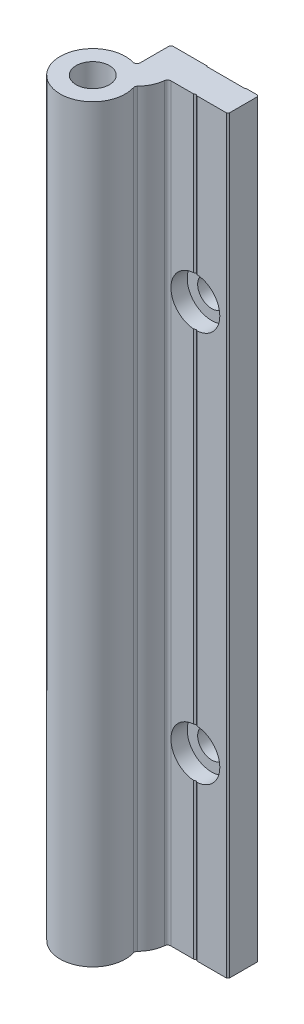
ISO-10303-21;
HEADER;
FILE_DESCRIPTION(('STEP AP214'),'2;1');
FILE_NAME('part.step','',(''),(''),'','','');
FILE_SCHEMA(('AUTOMOTIVE_DESIGN { 1 0 10303 214 1 1 1 1 }'));
ENDSEC;
DATA;
#1=APPLICATION_CONTEXT('core data for automotive mechanical design processes');
#2=APPLICATION_PROTOCOL_DEFINITION('international standard','automotive_design',2000,#1);
#3=PRODUCT_CONTEXT('',#1,'mechanical');
#4=PRODUCT('Part','Part','',(#3));
#5=PRODUCT_RELATED_PRODUCT_CATEGORY('part','',(#4));
#6=PRODUCT_DEFINITION_FORMATION('','',#4);
#7=PRODUCT_DEFINITION_CONTEXT('part definition',#1,'design');
#8=PRODUCT_DEFINITION('design','',#6,#7);
#9=PRODUCT_DEFINITION_SHAPE('','',#8);
#10=(LENGTH_UNIT() NAMED_UNIT(*) SI_UNIT(.MILLI.,.METRE.));
#11=(NAMED_UNIT(*) PLANE_ANGLE_UNIT() SI_UNIT($,.RADIAN.));
#12=(NAMED_UNIT(*) SI_UNIT($,.STERADIAN.) SOLID_ANGLE_UNIT());
#13=UNCERTAINTY_MEASURE_WITH_UNIT(LENGTH_MEASURE(1.E-05),#10,'distance_accuracy_value','');
#14=(GEOMETRIC_REPRESENTATION_CONTEXT(3) GLOBAL_UNCERTAINTY_ASSIGNED_CONTEXT((#13)) GLOBAL_UNIT_ASSIGNED_CONTEXT((#10,
#11,#12)) REPRESENTATION_CONTEXT('',''));
#15=CARTESIAN_POINT('',(0.,0.,0.));
#16=DIRECTION('',(0.,0.,1.));
#17=DIRECTION('',(1.,0.,0.));
#18=AXIS2_PLACEMENT_3D('',#15,#16,#17);
#19=CARTESIAN_POINT('',(-31.,0.,20.));
#20=DIRECTION('',(0.,1.,0.));
#21=DIRECTION('',(0.272727272012548,0.,-0.962091386044275));
#22=AXIS2_PLACEMENT_3D('',#19,#20,#21);
#23=CYLINDRICAL_SURFACE('',#22,9.999999998689);
#24=DIRECTION('',(0.,-1.,0.));
#25=VECTOR('',#24,1.);
#26=CARTESIAN_POINT('',(-28.272727280232,230.,10.379086140819));
#27=LINE('',#26,#25);
#28=CARTESIAN_POINT('',(-28.272727280232,0.,10.379086140819));
#29=VERTEX_POINT('',#28);
#30=CARTESIAN_POINT('',(-28.272727280232,230.,10.379086140819));
#31=VERTEX_POINT('',#30);
#32=EDGE_CURVE('E197',#29,#31,#27,.F.);
#33=ORIENTED_EDGE('',*,*,#32,.F.);
#34=CARTESIAN_POINT('',(-31.,0.,20.));
#35=DIRECTION('',(0.,1.,0.));
#36=DIRECTION('',(0.272727272012548,0.,-0.962091386044275));
#37=AXIS2_PLACEMENT_3D('',#34,#35,#36);
#38=CIRCLE('',#37,9.999999998689);
#39=CARTESIAN_POINT('',(-21.44507801,0.,17.04983632));
#40=VERTEX_POINT('',#39);
#41=EDGE_CURVE('E183',#40,#29,#38,.F.);
#42=ORIENTED_EDGE('',*,*,#41,.F.);
#43=DIRECTION('',(0.,1.,0.));
#44=VECTOR('',#43,1.);
#45=CARTESIAN_POINT('',(-21.44507801,0.,17.04983632));
#46=LINE('',#45,#44);
#47=CARTESIAN_POINT('',(-21.44507801,230.,17.04983632));
#48=VERTEX_POINT('',#47);
#49=EDGE_CURVE('E196',#40,#48,#46,.T.);
#50=ORIENTED_EDGE('',*,*,#49,.T.);
#51=CARTESIAN_POINT('',(-31.,230.,20.));
#52=DIRECTION('',(0.,-1.,0.));
#53=DIRECTION('',(0.95549219912528,0.,-0.295016368038685));
#54=AXIS2_PLACEMENT_3D('',#51,#52,#53);
#55=CIRCLE('',#54,9.999999998689);
#56=EDGE_CURVE('E209',#48,#31,#55,.T.);
#57=ORIENTED_EDGE('',*,*,#56,.T.);
#58=EDGE_LOOP('',(#33,#42,#50,#57));
#59=FACE_BOUND('',#58,.T.);
#60=ADVANCED_FACE('F16',(#59),#23,.T.);
#61=CARTESIAN_POINT('',(-41.529458419107,230.,-1.E-08));
#62=DIRECTION('',(0.,1.,0.));
#63=DIRECTION('',(0.,0.,1.));
#64=AXIS2_PLACEMENT_3D('',#61,#62,#63);
#65=PLANE('',#64);
#66=DIRECTION('',(-1.,0.,0.));
#67=VECTOR('',#66,1.);
#68=CARTESIAN_POINT('',(-16.00000001,230.,-1.E-08));
#69=LINE('',#68,#67);
#70=CARTESIAN_POINT('',(-26.50000001,230.,-1.E-08));
#71=VERTEX_POINT('',#70);
#72=CARTESIAN_POINT('',(-16.00000001,230.,-1.E-08));
#73=VERTEX_POINT('',#72);
#74=EDGE_CURVE('E220',#71,#73,#69,.F.);
#75=ORIENTED_EDGE('',*,*,#74,.F.);
#76=DIRECTION('',(-0.707106781186553,0.,0.707106781186542));
#77=VECTOR('',#76,1.);
#78=CARTESIAN_POINT('',(-26.50000001,230.,-1.E-08));
#79=LINE('',#78,#77);
#80=CARTESIAN_POINT('',(-27.00000001,230.,0.49999999));
#81=VERTEX_POINT('',#80);
#82=EDGE_CURVE('E225',#81,#71,#79,.F.);
#83=ORIENTED_EDGE('',*,*,#82,.F.);
#84=DIRECTION('',(2.73935E-10,0.,1.));
#85=VECTOR('',#84,1.);
#86=CARTESIAN_POINT('',(-27.00000001,230.,0.49999999));
#87=LINE('',#86,#85);
#88=CARTESIAN_POINT('',(-27.000000007557,230.,9.41699475));
#89=VERTEX_POINT('',#88);
#90=EDGE_CURVE('E229',#89,#81,#87,.F.);
#91=ORIENTED_EDGE('',*,*,#90,.F.);
#92=CARTESIAN_POINT('',(-28.00000001,230.,9.41699475));
#93=DIRECTION('',(0.,-1.,0.));
#94=DIRECTION('',(1.,0.,0.));
#95=AXIS2_PLACEMENT_3D('',#92,#93,#94);
#96=CIRCLE('',#95,1.000000002443);
#97=EDGE_CURVE('E233',#31,#89,#96,.F.);
#98=ORIENTED_EDGE('',*,*,#97,.F.);
#99=ORIENTED_EDGE('',*,*,#56,.F.);
#100=CARTESIAN_POINT('',(-20.48958581,230.,16.75481996));
#101=DIRECTION('',(0.,-1.,0.));
#102=DIRECTION('',(-0.955492201467411,0.,0.295016360453045));
#103=AXIS2_PLACEMENT_3D('',#100,#101,#102);
#104=CIRCLE('',#103,1.000000000992);
#105=CARTESIAN_POINT('',(-21.204863349397,230.,16.055979460589));
#106=VERTEX_POINT('',#105);
#107=EDGE_CURVE('E237',#106,#48,#104,.F.);
#108=ORIENTED_EDGE('',*,*,#107,.F.);
#109=CARTESIAN_POINT('',(-28.,230.,9.41699475));
#110=DIRECTION('',(0.,1.,0.));
#111=DIRECTION('',(0.715277541820788,0.,0.698840495511538));
#112=AXIS2_PLACEMENT_3D('',#109,#110,#111);
#113=CIRCLE('',#112,9.500000001863);
#114=CARTESIAN_POINT('',(-18.550668239928,230.,10.396856640007));
#115=VERTEX_POINT('',#114);
#116=EDGE_CURVE('E241',#115,#106,#113,.F.);
#117=ORIENTED_EDGE('',*,*,#116,.F.);
#118=CARTESIAN_POINT('',(-17.55600174,230.,10.5));
#119=DIRECTION('',(0.,-1.,0.));
#120=DIRECTION('',(-0.994666500529985,0.,-0.103143360054993));
#121=AXIS2_PLACEMENT_3D('',#118,#119,#120);
#122=CIRCLE('',#121,0.999999999734);
#123=CARTESIAN_POINT('',(-17.55600174,230.,9.500000000266));
#124=VERTEX_POINT('',#123);
#125=EDGE_CURVE('E245',#124,#115,#122,.F.);
#126=ORIENTED_EDGE('',*,*,#125,.F.);
#127=DIRECTION('',(1.,0.,0.));
#128=VECTOR('',#127,1.);
#129=CARTESIAN_POINT('',(-17.55600174,230.,9.5));
#130=LINE('',#129,#128);
#131=CARTESIAN_POINT('',(-10.5,230.,9.5));
#132=VERTEX_POINT('',#131);
#133=EDGE_CURVE('E249',#132,#124,#130,.F.);
#134=ORIENTED_EDGE('',*,*,#133,.F.);
#135=DIRECTION('',(0.866025407230551,0.,-0.499999994031158));
#136=VECTOR('',#135,1.);
#137=CARTESIAN_POINT('',(-10.5,230.,9.5));
#138=LINE('',#137,#136);
#139=CARTESIAN_POINT('',(-10.,230.,9.21132487));
#140=VERTEX_POINT('',#139);
#141=EDGE_CURVE('E253',#140,#132,#138,.F.);
#142=ORIENTED_EDGE('',*,*,#141,.F.);
#143=DIRECTION('',(0.866025407230547,0.,0.499999994031166));
#144=VECTOR('',#143,1.);
#145=CARTESIAN_POINT('',(-10.,230.,9.21132487));
#146=LINE('',#145,#144);
#147=CARTESIAN_POINT('',(-9.5,230.,9.5));
#148=VERTEX_POINT('',#147);
#149=EDGE_CURVE('E257',#148,#140,#146,.F.);
#150=ORIENTED_EDGE('',*,*,#149,.F.);
#151=DIRECTION('',(1.,0.,0.));
#152=VECTOR('',#151,1.);
#153=CARTESIAN_POINT('',(-9.5,230.,9.5));
#154=LINE('',#153,#152);
#155=CARTESIAN_POINT('',(-0.5,230.,9.5));
#156=VERTEX_POINT('',#155);
#157=EDGE_CURVE('E261',#156,#148,#154,.F.);
#158=ORIENTED_EDGE('',*,*,#157,.F.);
#159=DIRECTION('',(0.70710678118655,0.,-0.707106781186545));
#160=VECTOR('',#159,1.);
#161=CARTESIAN_POINT('',(-0.5,230.,9.5));
#162=LINE('',#161,#160);
#163=CARTESIAN_POINT('',(0.,230.,9.));
#164=VERTEX_POINT('',#163);
#165=EDGE_CURVE('E265',#164,#156,#162,.F.);
#166=ORIENTED_EDGE('',*,*,#165,.F.);
#167=DIRECTION('',(-7.35295E-10,0.,-1.));
#168=VECTOR('',#167,1.);
#169=CARTESIAN_POINT('',(0.,230.,9.));
#170=LINE('',#169,#168);
#171=CARTESIAN_POINT('',(-6.25E-09,230.,0.49999999125));
#172=VERTEX_POINT('',#171);
#173=EDGE_CURVE('E269',#172,#164,#170,.F.);
#174=ORIENTED_EDGE('',*,*,#173,.F.);
#175=DIRECTION('',(-0.707106782954312,0.,-0.707106779418783));
#176=VECTOR('',#175,1.);
#177=CARTESIAN_POINT('',(-6.25E-09,230.,0.49999999125));
#178=LINE('',#177,#176);
#179=CARTESIAN_POINT('',(-0.50000001,230.,-1.E-08));
#180=VERTEX_POINT('',#179);
#181=EDGE_CURVE('E273',#180,#172,#178,.F.);
#182=ORIENTED_EDGE('',*,*,#181,.F.);
#183=DIRECTION('',(-1.,0.,0.));
#184=VECTOR('',#183,1.);
#185=CARTESIAN_POINT('',(-0.50000001,230.,-1.E-08));
#186=LINE('',#185,#184);
#187=CARTESIAN_POINT('',(-4.00000001,230.,-1.E-08));
#188=VERTEX_POINT('',#187);
#189=EDGE_CURVE('E277',#188,#180,#186,.F.);
#190=ORIENTED_EDGE('',*,*,#189,.F.);
#191=DIRECTION('',(-0.707106781186553,0.,0.707106781186542));
#192=VECTOR('',#191,1.);
#193=CARTESIAN_POINT('',(-4.00000001,230.,-1.E-08));
#194=LINE('',#193,#192);
#195=CARTESIAN_POINT('',(-4.20000001,230.,0.19999999));
#196=VERTEX_POINT('',#195);
#197=EDGE_CURVE('E281',#196,#188,#194,.F.);
#198=ORIENTED_EDGE('',*,*,#197,.F.);
#199=DIRECTION('',(-1.,0.,0.));
#200=VECTOR('',#199,1.);
#201=CARTESIAN_POINT('',(-4.20000001,230.,0.19999999));
#202=LINE('',#201,#200);
#203=CARTESIAN_POINT('',(-15.80000001,230.,0.19999999));
#204=VERTEX_POINT('',#203);
#205=EDGE_CURVE('E285',#204,#196,#202,.F.);
#206=ORIENTED_EDGE('',*,*,#205,.F.);
#207=DIRECTION('',(-0.707106781186553,0.,-0.707106781186543));
#208=VECTOR('',#207,1.);
#209=CARTESIAN_POINT('',(-15.80000001,230.,0.19999999));
#210=LINE('',#209,#208);
#211=EDGE_CURVE('E289',#73,#204,#210,.F.);
#212=ORIENTED_EDGE('',*,*,#211,.F.);
#213=EDGE_LOOP('',(#75,#83,#91,#98,#99,#108,#117,#126,#134,#142,#150,#158,#166,#174,#182,#190,
#198,#206,#212));
#214=FACE_BOUND('',#213,.T.);
#215=CARTESIAN_POINT('',(-31.,230.,20.));
#216=DIRECTION('',(0.,-1.,0.));
#217=DIRECTION('',(1.,0.,0.));
#218=AXIS2_PLACEMENT_3D('',#215,#216,#217);
#219=CIRCLE('',#218,5.1);
#220=CARTESIAN_POINT('',(-25.9,230.,20.));
#221=VERTEX_POINT('',#220);
#222=EDGE_CURVE('E293',#221,#221,#219,.T.);
#223=ORIENTED_EDGE('',*,*,#222,.T.);
#224=EDGE_LOOP('',(#223));
#225=FACE_BOUND('',#224,.T.);
#226=ADVANCED_FACE('F724',(#214,#225),#65,.T.);
#227=CARTESIAN_POINT('',(-28.00000001,0.,9.41699475));
#228=DIRECTION('',(0.,1.,0.));
#229=DIRECTION('',(-0.27272726911178,0.,0.962091386866565));
#230=AXIS2_PLACEMENT_3D('',#227,#228,#229);
#231=CYLINDRICAL_SURFACE('',#230,1.000000003257);
#232=ORIENTED_EDGE('',*,*,#97,.T.);
#233=DIRECTION('',(0.,-1.,0.));
#234=VECTOR('',#233,1.);
#235=CARTESIAN_POINT('',(-27.000000006743,230.,9.41699475));
#236=LINE('',#235,#234);
#237=CARTESIAN_POINT('',(-27.000000006743,0.,9.41699475));
#238=VERTEX_POINT('',#237);
#239=EDGE_CURVE('E204',#238,#89,#236,.F.);
#240=ORIENTED_EDGE('',*,*,#239,.F.);
#241=CARTESIAN_POINT('',(-28.00000001,0.,9.41699475));
#242=DIRECTION('',(0.,-1.,0.));
#243=DIRECTION('',(1.,0.,0.));
#244=AXIS2_PLACEMENT_3D('',#241,#242,#243);
#245=CIRCLE('',#244,1.000000003257);
#246=EDGE_CURVE('E189',#238,#29,#245,.T.);
#247=ORIENTED_EDGE('',*,*,#246,.T.);
#248=ORIENTED_EDGE('',*,*,#32,.T.);
#249=EDGE_LOOP('',(#232,#240,#247,#248));
#250=FACE_BOUND('',#249,.T.);
#251=ADVANCED_FACE('F202',(#250),#231,.F.);
#252=CARTESIAN_POINT('',(-41.1423842036,0.,-1.E-08));
#253=DIRECTION('',(0.,-1.,0.));
#254=DIRECTION('',(1.,0.,0.));
#255=AXIS2_PLACEMENT_3D('',#252,#253,#254);
#256=PLANE('',#255);
#257=DIRECTION('',(0.707106781186548,0.,-0.707106781186547));
#258=VECTOR('',#257,1.);
#259=CARTESIAN_POINT('',(-27.00000001,0.,0.49999999));
#260=LINE('',#259,#258);
#261=CARTESIAN_POINT('',(-27.00000001,0.,0.49999999));
#262=VERTEX_POINT('',#261);
#263=CARTESIAN_POINT('',(-26.50000001,0.,-1.E-08));
#264=VERTEX_POINT('',#263);
#265=EDGE_CURVE('E205',#262,#264,#260,.T.);
#266=ORIENTED_EDGE('',*,*,#265,.T.);
#267=DIRECTION('',(1.,0.,0.));
#268=VECTOR('',#267,1.);
#269=CARTESIAN_POINT('',(-26.50000001,0.,-1.E-08));
#270=LINE('',#269,#268);
#271=CARTESIAN_POINT('',(-16.00000001,0.,-1.E-08));
#272=VERTEX_POINT('',#271);
#273=EDGE_CURVE('E304',#264,#272,#270,.T.);
#274=ORIENTED_EDGE('',*,*,#273,.T.);
#275=DIRECTION('',(0.707106781186553,0.,0.707106781186543));
#276=VECTOR('',#275,1.);
#277=CARTESIAN_POINT('',(-16.00000001,0.,-1.E-08));
#278=LINE('',#277,#276);
#279=CARTESIAN_POINT('',(-15.80000001,0.,0.19999999));
#280=VERTEX_POINT('',#279);
#281=EDGE_CURVE('E309',#272,#280,#278,.T.);
#282=ORIENTED_EDGE('',*,*,#281,.T.);
#283=DIRECTION('',(1.,0.,0.));
#284=VECTOR('',#283,1.);
#285=CARTESIAN_POINT('',(-15.80000001,0.,0.19999999));
#286=LINE('',#285,#284);
#287=CARTESIAN_POINT('',(-4.20000001,0.,0.19999999));
#288=VERTEX_POINT('',#287);
#289=EDGE_CURVE('E314',#280,#288,#286,.T.);
#290=ORIENTED_EDGE('',*,*,#289,.T.);
#291=DIRECTION('',(0.707106781186528,0.,-0.707106781186567));
#292=VECTOR('',#291,1.);
#293=CARTESIAN_POINT('',(-4.20000001,0.,0.19999999));
#294=LINE('',#293,#292);
#295=CARTESIAN_POINT('',(-4.00000001,0.,-1.E-08));
#296=VERTEX_POINT('',#295);
#297=EDGE_CURVE('E319',#288,#296,#294,.T.);
#298=ORIENTED_EDGE('',*,*,#297,.T.);
#299=DIRECTION('',(1.,0.,0.));
#300=VECTOR('',#299,1.);
#301=CARTESIAN_POINT('',(-4.00000001,0.,-1.E-08));
#302=LINE('',#301,#300);
#303=CARTESIAN_POINT('',(-0.50000001,0.,-1.E-08));
#304=VERTEX_POINT('',#303);
#305=EDGE_CURVE('E324',#296,#304,#302,.T.);
#306=ORIENTED_EDGE('',*,*,#305,.T.);
#307=DIRECTION('',(0.707106784722084,0.,0.707106777651011));
#308=VECTOR('',#307,1.);
#309=CARTESIAN_POINT('',(-0.50000001,0.,-1.E-08));
#310=LINE('',#309,#308);
#311=CARTESIAN_POINT('',(-3.835E-09,0.,0.499999991165));
#312=VERTEX_POINT('',#311);
#313=EDGE_CURVE('E329',#304,#312,#310,.T.);
#314=ORIENTED_EDGE('',*,*,#313,.T.);
#315=DIRECTION('',(4.5117E-10,0.,1.));
#316=VECTOR('',#315,1.);
#317=CARTESIAN_POINT('',(-3.835E-09,0.,0.499999991165));
#318=LINE('',#317,#316);
#319=CARTESIAN_POINT('',(0.,0.,9.));
#320=VERTEX_POINT('',#319);
#321=EDGE_CURVE('E334',#312,#320,#318,.T.);
#322=ORIENTED_EDGE('',*,*,#321,.T.);
#323=DIRECTION('',(-0.707106781186545,0.,0.70710678118655));
#324=VECTOR('',#323,1.);
#325=CARTESIAN_POINT('',(0.,0.,9.));
#326=LINE('',#325,#324);
#327=CARTESIAN_POINT('',(-0.5,0.,9.5));
#328=VERTEX_POINT('',#327);
#329=EDGE_CURVE('E339',#320,#328,#326,.T.);
#330=ORIENTED_EDGE('',*,*,#329,.T.);
#331=DIRECTION('',(-1.,0.,0.));
#332=VECTOR('',#331,1.);
#333=CARTESIAN_POINT('',(-0.5,0.,9.5));
#334=LINE('',#333,#332);
#335=CARTESIAN_POINT('',(-9.5,0.,9.5));
#336=VERTEX_POINT('',#335);
#337=EDGE_CURVE('E344',#328,#336,#334,.T.);
#338=ORIENTED_EDGE('',*,*,#337,.T.);
#339=DIRECTION('',(-0.866025407230548,0.,-0.499999994031164));
#340=VECTOR('',#339,1.);
#341=CARTESIAN_POINT('',(-9.5,0.,9.5));
#342=LINE('',#341,#340);
#343=CARTESIAN_POINT('',(-10.,0.,9.21132487));
#344=VERTEX_POINT('',#343);
#345=EDGE_CURVE('E349',#336,#344,#342,.T.);
#346=ORIENTED_EDGE('',*,*,#345,.T.);
#347=DIRECTION('',(-0.866025407230543,0.,0.499999994031172));
#348=VECTOR('',#347,1.);
#349=CARTESIAN_POINT('',(-10.,0.,9.21132487));
#350=LINE('',#349,#348);
#351=CARTESIAN_POINT('',(-10.5,0.,9.5));
#352=VERTEX_POINT('',#351);
#353=EDGE_CURVE('E354',#344,#352,#350,.T.);
#354=ORIENTED_EDGE('',*,*,#353,.T.);
#355=DIRECTION('',(-1.,0.,0.));
#356=VECTOR('',#355,1.);
#357=CARTESIAN_POINT('',(-10.5,0.,9.5));
#358=LINE('',#357,#356);
#359=CARTESIAN_POINT('',(-17.55600174,0.,9.5));
#360=VERTEX_POINT('',#359);
#361=EDGE_CURVE('E359',#352,#360,#358,.T.);
#362=ORIENTED_EDGE('',*,*,#361,.T.);
#363=CARTESIAN_POINT('',(-17.55600174,0.,10.5));
#364=DIRECTION('',(0.,1.,0.));
#365=DIRECTION('',(0.,0.,-1.));
#366=AXIS2_PLACEMENT_3D('',#363,#364,#365);
#367=CIRCLE('',#366,1.);
#368=CARTESIAN_POINT('',(-18.55066824053,0.,10.396856639945));
#369=VERTEX_POINT('',#368);
#370=EDGE_CURVE('E364',#369,#360,#367,.F.);
#371=ORIENTED_EDGE('',*,*,#370,.F.);
#372=CARTESIAN_POINT('',(-28.,0.,9.41699475));
#373=DIRECTION('',(0.,-1.,0.));
#374=DIRECTION('',(0.994666500865166,0.,0.103143356822661));
#375=AXIS2_PLACEMENT_3D('',#372,#373,#374);
#376=CIRCLE('',#375,9.500000001524);
#377=CARTESIAN_POINT('',(-21.204863351612,0.,16.055979458425));
#378=VERTEX_POINT('',#377);
#379=EDGE_CURVE('E369',#369,#378,#376,.T.);
#380=ORIENTED_EDGE('',*,*,#379,.T.);
#381=CARTESIAN_POINT('',(-20.48958581,0.,16.75481996));
#382=DIRECTION('',(0.,1.,0.));
#383=DIRECTION('',(-0.715277538687942,0.,-0.69884049871807));
#384=AXIS2_PLACEMENT_3D('',#381,#382,#383);
#385=CIRCLE('',#384,1.000000002828);
#386=EDGE_CURVE('E192',#40,#378,#385,.F.);
#387=ORIENTED_EDGE('',*,*,#386,.F.);
#388=ORIENTED_EDGE('',*,*,#41,.T.);
#389=ORIENTED_EDGE('',*,*,#246,.F.);
#390=DIRECTION('',(-1.82623E-10,0.,-1.));
#391=VECTOR('',#390,1.);
#392=CARTESIAN_POINT('',(-27.000000008372,0.,9.41699475));
#393=LINE('',#392,#391);
#394=EDGE_CURVE('E376',#238,#262,#393,.T.);
#395=ORIENTED_EDGE('',*,*,#394,.T.);
#396=EDGE_LOOP('',(#266,#274,#282,#290,#298,#306,#314,#322,#330,#338,#346,#354,#362,#371,#380,
#387,#388,#389,#395));
#397=FACE_BOUND('',#396,.T.);
#398=CARTESIAN_POINT('',(-31.,0.,20.));
#399=DIRECTION('',(0.,1.,0.));
#400=DIRECTION('',(-1.,0.,0.));
#401=AXIS2_PLACEMENT_3D('',#398,#399,#400);
#402=CIRCLE('',#401,5.1);
#403=CARTESIAN_POINT('',(-36.1,0.,20.));
#404=VERTEX_POINT('',#403);
#405=EDGE_CURVE('E380',#404,#404,#402,.T.);
#406=ORIENTED_EDGE('',*,*,#405,.T.);
#407=EDGE_LOOP('',(#406));
#408=FACE_BOUND('',#407,.T.);
#409=ADVANCED_FACE('F186',(#397,#408),#256,.T.);
#410=CARTESIAN_POINT('',(-20.48958581,0.,16.75481996));
#411=DIRECTION('',(0.,1.,0.));
#412=DIRECTION('',(-0.715277538687942,0.,-0.698840498718069));
#413=AXIS2_PLACEMENT_3D('',#410,#411,#412);
#414=CYLINDRICAL_SURFACE('',#413,1.000000001834);
#415=ORIENTED_EDGE('',*,*,#107,.T.);
#416=ORIENTED_EDGE('',*,*,#49,.F.);
#417=ORIENTED_EDGE('',*,*,#386,.T.);
#418=DIRECTION('',(0.,1.,0.));
#419=VECTOR('',#418,1.);
#420=CARTESIAN_POINT('',(-21.20486335,0.,16.05597946));
#421=LINE('',#420,#419);
#422=EDGE_CURVE('E385',#378,#106,#421,.T.);
#423=ORIENTED_EDGE('',*,*,#422,.T.);
#424=EDGE_LOOP('',(#415,#416,#417,#423));
#425=FACE_BOUND('',#424,.T.);
#426=ADVANCED_FACE('F736',(#425),#414,.F.);
#427=CARTESIAN_POINT('',(-16.00000001,0.,-1.E-08));
#428=DIRECTION('',(0.,0.,-1.));
#429=DIRECTION('',(-1.,0.,0.));
#430=AXIS2_PLACEMENT_3D('',#427,#428,#429);
#431=PLANE('',#430);
#432=ORIENTED_EDGE('',*,*,#74,.T.);
#433=DIRECTION('',(0.,-1.,0.));
#434=VECTOR('',#433,1.);
#435=CARTESIAN_POINT('',(-16.00000001,230.,-1.E-08));
#436=LINE('',#435,#434);
#437=EDGE_CURVE('E388',#272,#73,#436,.F.);
#438=ORIENTED_EDGE('',*,*,#437,.F.);
#439=ORIENTED_EDGE('',*,*,#273,.F.);
#440=DIRECTION('',(0.,1.,0.));
#441=VECTOR('',#440,1.);
#442=CARTESIAN_POINT('',(-26.50000001,0.,-1.E-08));
#443=LINE('',#442,#441);
#444=EDGE_CURVE('E392',#264,#71,#443,.T.);
#445=ORIENTED_EDGE('',*,*,#444,.T.);
#446=EDGE_LOOP('',(#432,#438,#439,#445));
#447=FACE_BOUND('',#446,.T.);
#448=ADVANCED_FACE('F739',(#447),#431,.T.);
#449=CARTESIAN_POINT('',(-26.50000001,0.,-1.E-08));
#450=DIRECTION('',(-0.707106781186548,0.,-0.707106781186548));
#451=DIRECTION('',(-0.707106781186548,0.,0.707106781186548));
#452=AXIS2_PLACEMENT_3D('',#449,#450,#451);
#453=PLANE('',#452);
#454=ORIENTED_EDGE('',*,*,#82,.T.);
#455=ORIENTED_EDGE('',*,*,#444,.F.);
#456=ORIENTED_EDGE('',*,*,#265,.F.);
#457=DIRECTION('',(0.,1.,0.));
#458=VECTOR('',#457,1.);
#459=CARTESIAN_POINT('',(-27.00000001,0.,0.49999999));
#460=LINE('',#459,#458);
#461=EDGE_CURVE('E397',#262,#81,#460,.T.);
#462=ORIENTED_EDGE('',*,*,#461,.T.);
#463=EDGE_LOOP('',(#454,#455,#456,#462));
#464=FACE_BOUND('',#463,.T.);
#465=ADVANCED_FACE('F743',(#464),#453,.T.);
#466=CARTESIAN_POINT('',(-27.00000001,0.,0.49999999));
#467=DIRECTION('',(-1.,0.,0.));
#468=DIRECTION('',(0.,0.,1.));
#469=AXIS2_PLACEMENT_3D('',#466,#467,#468);
#470=PLANE('',#469);
#471=ORIENTED_EDGE('',*,*,#90,.T.);
#472=ORIENTED_EDGE('',*,*,#461,.F.);
#473=ORIENTED_EDGE('',*,*,#394,.F.);
#474=ORIENTED_EDGE('',*,*,#239,.T.);
#475=EDGE_LOOP('',(#471,#472,#473,#474));
#476=FACE_BOUND('',#475,.T.);
#477=ADVANCED_FACE('F747',(#476),#470,.T.);
#478=CARTESIAN_POINT('',(-28.,0.,9.41699475));
#479=DIRECTION('',(0.,1.,0.));
#480=DIRECTION('',(0.715277541820787,0.,0.698840495511538));
#481=AXIS2_PLACEMENT_3D('',#478,#479,#480);
#482=CYLINDRICAL_SURFACE('',#481,9.50000000179);
#483=ORIENTED_EDGE('',*,*,#116,.T.);
#484=ORIENTED_EDGE('',*,*,#422,.F.);
#485=ORIENTED_EDGE('',*,*,#379,.F.);
#486=DIRECTION('',(0.,1.,0.));
#487=VECTOR('',#486,1.);
#488=CARTESIAN_POINT('',(-18.55066824,0.,10.39685664));
#489=LINE('',#488,#487);
#490=EDGE_CURVE('E402',#369,#115,#489,.T.);
#491=ORIENTED_EDGE('',*,*,#490,.T.);
#492=EDGE_LOOP('',(#483,#484,#485,#491));
#493=FACE_BOUND('',#492,.T.);
#494=ADVANCED_FACE('F751',(#493),#482,.T.);
#495=CARTESIAN_POINT('',(-17.55600174,0.,10.5));
#496=DIRECTION('',(0.,1.,0.));
#497=DIRECTION('',(0.,0.,-1.));
#498=AXIS2_PLACEMENT_3D('',#495,#496,#497);
#499=CYLINDRICAL_SURFACE('',#498,1.);
#500=ORIENTED_EDGE('',*,*,#125,.T.);
#501=ORIENTED_EDGE('',*,*,#490,.F.);
#502=ORIENTED_EDGE('',*,*,#370,.T.);
#503=DIRECTION('',(0.,1.,0.));
#504=VECTOR('',#503,1.);
#505=CARTESIAN_POINT('',(-17.55600174,0.,9.5));
#506=LINE('',#505,#504);
#507=EDGE_CURVE('E407',#360,#124,#506,.T.);
#508=ORIENTED_EDGE('',*,*,#507,.T.);
#509=EDGE_LOOP('',(#500,#501,#502,#508));
#510=FACE_BOUND('',#509,.T.);
#511=ADVANCED_FACE('F754',(#510),#499,.F.);
#512=CARTESIAN_POINT('',(-17.55600174,0.,9.5));
#513=DIRECTION('',(0.,0.,1.));
#514=DIRECTION('',(1.,0.,0.));
#515=AXIS2_PLACEMENT_3D('',#512,#513,#514);
#516=PLANE('',#515);
#517=CARTESIAN_POINT('',(-10.,175.,9.5));
#518=DIRECTION('',(0.,0.,-1.));
#519=DIRECTION('',(-1.,0.,0.));
#520=AXIS2_PLACEMENT_3D('',#517,#518,#519);
#521=CIRCLE('',#520,7.5);
#522=CARTESIAN_POINT('',(-10.5,167.516685226452,9.5));
#523=VERTEX_POINT('',#522);
#524=CARTESIAN_POINT('',(-10.5,182.483314773548,9.5));
#525=VERTEX_POINT('',#524);
#526=EDGE_CURVE('E412',#523,#525,#521,.T.);
#527=ORIENTED_EDGE('',*,*,#526,.T.);
#528=DIRECTION('',(0.,1.,0.));
#529=VECTOR('',#528,1.);
#530=CARTESIAN_POINT('',(-10.5,182.483314773548,9.5));
#531=LINE('',#530,#529);
#532=EDGE_CURVE('E417',#525,#132,#531,.T.);
#533=ORIENTED_EDGE('',*,*,#532,.T.);
#534=ORIENTED_EDGE('',*,*,#133,.T.);
#535=ORIENTED_EDGE('',*,*,#507,.F.);
#536=ORIENTED_EDGE('',*,*,#361,.F.);
#537=DIRECTION('',(0.,1.,0.));
#538=VECTOR('',#537,1.);
#539=CARTESIAN_POINT('',(-10.5,0.,9.5));
#540=LINE('',#539,#538);
#541=CARTESIAN_POINT('',(-10.5,47.516685226452,9.5));
#542=VERTEX_POINT('',#541);
#543=EDGE_CURVE('E422',#352,#542,#540,.T.);
#544=ORIENTED_EDGE('',*,*,#543,.T.);
#545=CARTESIAN_POINT('',(-10.,55.,9.5));
#546=DIRECTION('',(0.,0.,-1.));
#547=DIRECTION('',(-1.,0.,0.));
#548=AXIS2_PLACEMENT_3D('',#545,#546,#547);
#549=CIRCLE('',#548,7.5);
#550=CARTESIAN_POINT('',(-10.5,62.483314773548,9.5));
#551=VERTEX_POINT('',#550);
#552=EDGE_CURVE('E427',#542,#551,#549,.T.);
#553=ORIENTED_EDGE('',*,*,#552,.T.);
#554=DIRECTION('',(0.,1.,0.));
#555=VECTOR('',#554,1.);
#556=CARTESIAN_POINT('',(-10.5,62.483314773548,9.5));
#557=LINE('',#556,#555);
#558=EDGE_CURVE('E432',#551,#523,#557,.T.);
#559=ORIENTED_EDGE('',*,*,#558,.T.);
#560=EDGE_LOOP('',(#527,#533,#534,#535,#536,#544,#553,#559));
#561=FACE_BOUND('',#560,.T.);
#562=ADVANCED_FACE('F463',(#561),#516,.T.);
#563=CARTESIAN_POINT('',(-10.5,182.483314773548,9.5));
#564=DIRECTION('',(0.499999994031163,0.,0.866025407230549));
#565=DIRECTION('',(0.866025407230549,0.,-0.499999994031163));
#566=AXIS2_PLACEMENT_3D('',#563,#564,#565);
#567=PLANE('',#566);
#568=CARTESIAN_POINT('',(-10.5,182.483314773548,9.5));
#569=CARTESIAN_POINT('',(-10.3335652531924,182.49443516283,9.4039088556576));
#570=CARTESIAN_POINT('',(-10.1668058392343,182.5,9.30763026465145));
#571=CARTESIAN_POINT('',(-10.0000000000002,182.5,9.21132487000011));
#572=B_SPLINE_CURVE_WITH_KNOTS('',3,(#568,#569,#570,#571),.UNSPECIFIED.,.F.,.F.,(4,4),(0.,1.),.UNSPECIFIED.);
#573=CARTESIAN_POINT('',(-10.,182.5,9.21132487));
#574=VERTEX_POINT('',#573);
#575=EDGE_CURVE('E437',#525,#574,#572,.T.);
#576=ORIENTED_EDGE('',*,*,#575,.T.);
#577=DIRECTION('',(0.,1.,0.));
#578=VECTOR('',#577,1.);
#579=CARTESIAN_POINT('',(-10.,182.5,9.21132487));
#580=LINE('',#579,#578);
#581=EDGE_CURVE('E450',#574,#140,#580,.T.);
#582=ORIENTED_EDGE('',*,*,#581,.T.);
#583=ORIENTED_EDGE('',*,*,#141,.T.);
#584=ORIENTED_EDGE('',*,*,#532,.F.);
#585=EDGE_LOOP('',(#576,#582,#583,#584));
#586=FACE_BOUND('',#585,.T.);
#587=ADVANCED_FACE('F452',(#586),#567,.T.);
#588=CARTESIAN_POINT('',(-10.,182.483314773548,9.21132487));
#589=DIRECTION('',(-0.499999994031163,0.,0.866025407230549));
#590=DIRECTION('',(0.866025407230549,0.,0.499999994031163));
#591=AXIS2_PLACEMENT_3D('',#588,#589,#590);
#592=PLANE('',#591);
#593=CARTESIAN_POINT('',(-10.,182.5,9.21132487));
#594=CARTESIAN_POINT('',(-9.83319416076501,182.5,9.30763026465184));
#595=CARTESIAN_POINT('',(-9.66643474680778,182.49443516283,9.40390885565749));
#596=CARTESIAN_POINT('',(-9.50000000000019,182.483314773548,9.49999999999989));
#597=B_SPLINE_CURVE_WITH_KNOTS('',3,(#593,#594,#595,#596),.UNSPECIFIED.,.F.,.F.,(4,4),(0.,1.),.UNSPECIFIED.);
#598=CARTESIAN_POINT('',(-9.5,182.483314773548,9.5));
#599=VERTEX_POINT('',#598);
#600=EDGE_CURVE('E486',#574,#599,#597,.T.);
#601=ORIENTED_EDGE('',*,*,#600,.T.);
#602=DIRECTION('',(0.,1.,0.));
#603=VECTOR('',#602,1.);
#604=CARTESIAN_POINT('',(-9.5,182.483314773548,9.5));
#605=LINE('',#604,#603);
#606=EDGE_CURVE('E477',#599,#148,#605,.T.);
#607=ORIENTED_EDGE('',*,*,#606,.T.);
#608=ORIENTED_EDGE('',*,*,#149,.T.);
#609=ORIENTED_EDGE('',*,*,#581,.F.);
#610=EDGE_LOOP('',(#601,#607,#608,#609));
#611=FACE_BOUND('',#610,.T.);
#612=ADVANCED_FACE('F462',(#611),#592,.T.);
#613=CARTESIAN_POINT('',(-9.5,0.,9.5));
#614=DIRECTION('',(0.,0.,1.));
#615=DIRECTION('',(1.,0.,0.));
#616=AXIS2_PLACEMENT_3D('',#613,#614,#615);
#617=PLANE('',#616);
#618=CARTESIAN_POINT('',(-10.,175.,9.5));
#619=DIRECTION('',(0.,0.,-1.));
#620=DIRECTION('',(1.,0.,0.));
#621=AXIS2_PLACEMENT_3D('',#618,#619,#620);
#622=CIRCLE('',#621,7.5);
#623=CARTESIAN_POINT('',(-9.5,167.516685226452,9.5));
#624=VERTEX_POINT('',#623);
#625=EDGE_CURVE('E485',#599,#624,#622,.T.);
#626=ORIENTED_EDGE('',*,*,#625,.T.);
#627=DIRECTION('',(0.,-1.,0.));
#628=VECTOR('',#627,1.);
#629=CARTESIAN_POINT('',(-9.5,167.516685226452,9.5));
#630=LINE('',#629,#628);
#631=CARTESIAN_POINT('',(-9.5,62.483314773548,9.5));
#632=VERTEX_POINT('',#631);
#633=EDGE_CURVE('E491',#632,#624,#630,.F.);
#634=ORIENTED_EDGE('',*,*,#633,.F.);
#635=CARTESIAN_POINT('',(-10.,55.,9.5));
#636=DIRECTION('',(0.,0.,-1.));
#637=DIRECTION('',(1.,0.,0.));
#638=AXIS2_PLACEMENT_3D('',#635,#636,#637);
#639=CIRCLE('',#638,7.5);
#640=CARTESIAN_POINT('',(-9.5,47.516685226452,9.5));
#641=VERTEX_POINT('',#640);
#642=EDGE_CURVE('E495',#632,#641,#639,.T.);
#643=ORIENTED_EDGE('',*,*,#642,.T.);
#644=DIRECTION('',(0.,-1.,0.));
#645=VECTOR('',#644,1.);
#646=CARTESIAN_POINT('',(-9.5,47.516685226452,9.5));
#647=LINE('',#646,#645);
#648=EDGE_CURVE('E500',#336,#641,#647,.F.);
#649=ORIENTED_EDGE('',*,*,#648,.F.);
#650=ORIENTED_EDGE('',*,*,#337,.F.);
#651=DIRECTION('',(0.,1.,0.));
#652=VECTOR('',#651,1.);
#653=CARTESIAN_POINT('',(-0.5,0.,9.5));
#654=LINE('',#653,#652);
#655=EDGE_CURVE('E505',#328,#156,#654,.T.);
#656=ORIENTED_EDGE('',*,*,#655,.T.);
#657=ORIENTED_EDGE('',*,*,#157,.T.);
#658=ORIENTED_EDGE('',*,*,#606,.F.);
#659=EDGE_LOOP('',(#626,#634,#643,#649,#650,#656,#657,#658));
#660=FACE_BOUND('',#659,.T.);
#661=ADVANCED_FACE('F468',(#660),#617,.T.);
#662=CARTESIAN_POINT('',(-0.5,0.,9.5));
#663=DIRECTION('',(0.707106781186548,0.,0.707106781186548));
#664=DIRECTION('',(0.707106781186548,0.,-0.707106781186548));
#665=AXIS2_PLACEMENT_3D('',#662,#663,#664);
#666=PLANE('',#665);
#667=ORIENTED_EDGE('',*,*,#165,.T.);
#668=ORIENTED_EDGE('',*,*,#655,.F.);
#669=ORIENTED_EDGE('',*,*,#329,.F.);
#670=DIRECTION('',(0.,1.,0.));
#671=VECTOR('',#670,1.);
#672=CARTESIAN_POINT('',(0.,0.,9.));
#673=LINE('',#672,#671);
#674=EDGE_CURVE('E510',#320,#164,#673,.T.);
#675=ORIENTED_EDGE('',*,*,#674,.T.);
#676=EDGE_LOOP('',(#667,#668,#669,#675));
#677=FACE_BOUND('',#676,.T.);
#678=ADVANCED_FACE('F801',(#677),#666,.T.);
#679=CARTESIAN_POINT('',(0.,0.,9.));
#680=DIRECTION('',(1.,0.,0.));
#681=DIRECTION('',(0.,0.,-1.));
#682=AXIS2_PLACEMENT_3D('',#679,#680,#681);
#683=PLANE('',#682);
#684=ORIENTED_EDGE('',*,*,#173,.T.);
#685=ORIENTED_EDGE('',*,*,#674,.F.);
#686=ORIENTED_EDGE('',*,*,#321,.F.);
#687=DIRECTION('',(0.,1.,3.69E-13));
#688=VECTOR('',#687,1.);
#689=CARTESIAN_POINT('',(0.,0.,0.499999991165));
#690=LINE('',#689,#688);
#691=EDGE_CURVE('E515',#312,#172,#690,.T.);
#692=ORIENTED_EDGE('',*,*,#691,.T.);
#693=EDGE_LOOP('',(#684,#685,#686,#692));
#694=FACE_BOUND('',#693,.T.);
#695=ADVANCED_FACE('F797',(#694),#683,.T.);
#696=CARTESIAN_POINT('',(-6.335E-09,0.,0.499999993665));
#697=DIRECTION('',(0.707106781186548,0.,-0.707106781186548));
#698=DIRECTION('',(-0.707106781186548,0.,-0.707106781186548));
#699=AXIS2_PLACEMENT_3D('',#696,#697,#698);
#700=PLANE('',#699);
#701=ORIENTED_EDGE('',*,*,#181,.T.);
#702=ORIENTED_EDGE('',*,*,#691,.F.);
#703=ORIENTED_EDGE('',*,*,#313,.F.);
#704=DIRECTION('',(0.,1.,0.));
#705=VECTOR('',#704,1.);
#706=CARTESIAN_POINT('',(-0.50000001,0.,-1.E-08));
#707=LINE('',#706,#705);
#708=EDGE_CURVE('E520',#304,#180,#707,.T.);
#709=ORIENTED_EDGE('',*,*,#708,.T.);
#710=EDGE_LOOP('',(#701,#702,#703,#709));
#711=FACE_BOUND('',#710,.T.);
#712=ADVANCED_FACE('F792',(#711),#700,.T.);
#713=CARTESIAN_POINT('',(-0.50000001,0.,-1.E-08));
#714=DIRECTION('',(0.,0.,-1.));
#715=DIRECTION('',(-1.,0.,0.));
#716=AXIS2_PLACEMENT_3D('',#713,#714,#715);
#717=PLANE('',#716);
#718=ORIENTED_EDGE('',*,*,#189,.T.);
#719=ORIENTED_EDGE('',*,*,#708,.F.);
#720=ORIENTED_EDGE('',*,*,#305,.F.);
#721=DIRECTION('',(0.,1.,0.));
#722=VECTOR('',#721,1.);
#723=CARTESIAN_POINT('',(-4.00000001,0.,-1.E-08));
#724=LINE('',#723,#722);
#725=EDGE_CURVE('E525',#296,#188,#724,.T.);
#726=ORIENTED_EDGE('',*,*,#725,.T.);
#727=EDGE_LOOP('',(#718,#719,#720,#726));
#728=FACE_BOUND('',#727,.T.);
#729=ADVANCED_FACE('F789',(#728),#717,.T.);
#730=CARTESIAN_POINT('',(-4.00000001,0.,-1.E-08));
#731=DIRECTION('',(-0.707106781186547,0.,-0.707106781186548));
#732=DIRECTION('',(-0.707106781186548,0.,0.707106781186547));
#733=AXIS2_PLACEMENT_3D('',#730,#731,#732);
#734=PLANE('',#733);
#735=ORIENTED_EDGE('',*,*,#197,.T.);
#736=ORIENTED_EDGE('',*,*,#725,.F.);
#737=ORIENTED_EDGE('',*,*,#297,.F.);
#738=DIRECTION('',(0.,1.,0.));
#739=VECTOR('',#738,1.);
#740=CARTESIAN_POINT('',(-4.20000001,0.,0.19999999));
#741=LINE('',#740,#739);
#742=EDGE_CURVE('E530',#288,#196,#741,.T.);
#743=ORIENTED_EDGE('',*,*,#742,.T.);
#744=EDGE_LOOP('',(#735,#736,#737,#743));
#745=FACE_BOUND('',#744,.T.);
#746=ADVANCED_FACE('F785',(#745),#734,.T.);
#747=CARTESIAN_POINT('',(-4.20000001,0.,0.19999999));
#748=DIRECTION('',(0.,0.,-1.));
#749=DIRECTION('',(-1.,0.,0.));
#750=AXIS2_PLACEMENT_3D('',#747,#748,#749);
#751=PLANE('',#750);
#752=ORIENTED_EDGE('',*,*,#205,.T.);
#753=ORIENTED_EDGE('',*,*,#742,.F.);
#754=ORIENTED_EDGE('',*,*,#289,.F.);
#755=DIRECTION('',(0.,1.,0.));
#756=VECTOR('',#755,1.);
#757=CARTESIAN_POINT('',(-15.80000001,0.,0.19999999));
#758=LINE('',#757,#756);
#759=EDGE_CURVE('E535',#280,#204,#758,.T.);
#760=ORIENTED_EDGE('',*,*,#759,.T.);
#761=EDGE_LOOP('',(#752,#753,#754,#760));
#762=FACE_BOUND('',#761,.T.);
#763=CARTESIAN_POINT('',(-10.,55.,0.19999999));
#764=DIRECTION('',(0.,0.,1.));
#765=DIRECTION('',(1.,0.,0.));
#766=AXIS2_PLACEMENT_3D('',#763,#764,#765);
#767=CIRCLE('',#766,4.3);
#768=CARTESIAN_POINT('',(-5.7,55.,0.19999999));
#769=VERTEX_POINT('',#768);
#770=EDGE_CURVE('E540',#769,#769,#767,.T.);
#771=ORIENTED_EDGE('',*,*,#770,.T.);
#772=EDGE_LOOP('',(#771));
#773=FACE_BOUND('',#772,.T.);
#774=CARTESIAN_POINT('',(-10.,175.,0.19999999));
#775=DIRECTION('',(0.,0.,1.));
#776=DIRECTION('',(1.,0.,0.));
#777=AXIS2_PLACEMENT_3D('',#774,#775,#776);
#778=CIRCLE('',#777,4.3);
#779=CARTESIAN_POINT('',(-5.7,175.,0.19999999));
#780=VERTEX_POINT('',#779);
#781=EDGE_CURVE('E545',#780,#780,#778,.T.);
#782=ORIENTED_EDGE('',*,*,#781,.T.);
#783=EDGE_LOOP('',(#782));
#784=FACE_BOUND('',#783,.T.);
#785=ADVANCED_FACE('F780',(#762,#773,#784),#751,.T.);
#786=CARTESIAN_POINT('',(-15.80000001,0.,0.19999999));
#787=DIRECTION('',(0.707106781186546,0.,-0.707106781186549));
#788=DIRECTION('',(-0.707106781186549,0.,-0.707106781186546));
#789=AXIS2_PLACEMENT_3D('',#786,#787,#788);
#790=PLANE('',#789);
#791=ORIENTED_EDGE('',*,*,#211,.T.);
#792=ORIENTED_EDGE('',*,*,#759,.F.);
#793=ORIENTED_EDGE('',*,*,#281,.F.);
#794=ORIENTED_EDGE('',*,*,#437,.T.);
#795=EDGE_LOOP('',(#791,#792,#793,#794));
#796=FACE_BOUND('',#795,.T.);
#797=ADVANCED_FACE('F775',(#796),#790,.T.);
#798=CARTESIAN_POINT('',(-31.,115.,20.));
#799=DIRECTION('',(0.,1.,0.));
#800=DIRECTION('',(-1.,0.,0.));
#801=AXIS2_PLACEMENT_3D('',#798,#799,#800);
#802=CYLINDRICAL_SURFACE('',#801,5.1);
#803=ORIENTED_EDGE('',*,*,#405,.F.);
#804=EDGE_LOOP('',(#803));
#805=FACE_BOUND('',#804,.T.);
#806=ORIENTED_EDGE('',*,*,#222,.F.);
#807=EDGE_LOOP('',(#806));
#808=FACE_BOUND('',#807,.T.);
#809=ADVANCED_FACE('F571',(#805,#808),#802,.F.);
#810=CARTESIAN_POINT('',(-10.,0.,9.21132487));
#811=DIRECTION('',(-0.499999994031163,0.,0.866025407230549));
#812=DIRECTION('',(0.866025407230549,0.,0.499999994031163));
#813=AXIS2_PLACEMENT_3D('',#810,#811,#812);
#814=PLANE('',#813);
#815=CARTESIAN_POINT('',(-9.50000000000019,47.5166852264521,9.49999999999989));
#816=CARTESIAN_POINT('',(-9.66643474680691,47.5055648371701,9.403908855658));
#817=CARTESIAN_POINT('',(-9.83319416076674,47.5000000000001,9.30763026465084));
#818=CARTESIAN_POINT('',(-10.,47.5000000000001,9.21132487));
#819=B_SPLINE_CURVE_WITH_KNOTS('',3,(#815,#816,#817,#818),.UNSPECIFIED.,.F.,.F.,(4,4),(0.,1.),.UNSPECIFIED.);
#820=CARTESIAN_POINT('',(-10.,47.5,9.21132487));
#821=VERTEX_POINT('',#820);
#822=EDGE_CURVE('E548',#641,#821,#819,.T.);
#823=ORIENTED_EDGE('',*,*,#822,.T.);
#824=DIRECTION('',(0.,-1.,0.));
#825=VECTOR('',#824,1.);
#826=CARTESIAN_POINT('',(-10.,47.5,9.21132487));
#827=LINE('',#826,#825);
#828=EDGE_CURVE('E558',#344,#821,#827,.F.);
#829=ORIENTED_EDGE('',*,*,#828,.F.);
#830=ORIENTED_EDGE('',*,*,#345,.F.);
#831=ORIENTED_EDGE('',*,*,#648,.T.);
#832=EDGE_LOOP('',(#823,#829,#830,#831));
#833=FACE_BOUND('',#832,.T.);
#834=ADVANCED_FACE('F560',(#833),#814,.T.);
#835=CARTESIAN_POINT('',(-10.5,0.,9.5));
#836=DIRECTION('',(0.499999994031163,0.,0.866025407230549));
#837=DIRECTION('',(0.866025407230549,0.,-0.499999994031163));
#838=AXIS2_PLACEMENT_3D('',#835,#836,#837);
#839=PLANE('',#838);
#840=CARTESIAN_POINT('',(-10.0000000000002,47.5000000000001,9.21132487000011));
#841=CARTESIAN_POINT('',(-10.1668058392334,47.5000000000001,9.30763026465095));
#842=CARTESIAN_POINT('',(-10.3335652531933,47.5055648371701,9.4039088556581));
#843=CARTESIAN_POINT('',(-10.5,47.5166852264521,9.5));
#844=B_SPLINE_CURVE_WITH_KNOTS('',3,(#840,#841,#842,#843),.UNSPECIFIED.,.F.,.F.,(4,4),(0.,1.),.UNSPECIFIED.);
#845=EDGE_CURVE('E595',#821,#542,#844,.T.);
#846=ORIENTED_EDGE('',*,*,#845,.T.);
#847=ORIENTED_EDGE('',*,*,#543,.F.);
#848=ORIENTED_EDGE('',*,*,#353,.F.);
#849=ORIENTED_EDGE('',*,*,#828,.T.);
#850=EDGE_LOOP('',(#846,#847,#848,#849));
#851=FACE_BOUND('',#850,.T.);
#852=ADVANCED_FACE('F570',(#851),#839,.T.);
#853=CARTESIAN_POINT('',(-10.,175.,7.));
#854=DIRECTION('',(0.,0.,-1.));
#855=DIRECTION('',(1.,0.,0.));
#856=AXIS2_PLACEMENT_3D('',#853,#854,#855);
#857=CYLINDRICAL_SURFACE('',#856,7.5);
#858=CARTESIAN_POINT('',(-10.,175.,4.5));
#859=DIRECTION('',(0.,0.,-1.));
#860=DIRECTION('',(1.,0.,0.));
#861=AXIS2_PLACEMENT_3D('',#858,#859,#860);
#862=CIRCLE('',#861,7.5);
#863=CARTESIAN_POINT('',(-2.5,175.,4.5));
#864=VERTEX_POINT('',#863);
#865=EDGE_CURVE('E586',#864,#864,#862,.T.);
#866=ORIENTED_EDGE('',*,*,#865,.T.);
#867=EDGE_LOOP('',(#866));
#868=FACE_BOUND('',#867,.T.);
#869=CARTESIAN_POINT('',(-10.0000000000002,167.5,9.21132487000011));
#870=CARTESIAN_POINT('',(-10.1668058392343,167.5,9.30763026465145));
#871=CARTESIAN_POINT('',(-10.3335652531924,167.50556483717,9.4039088556576));
#872=CARTESIAN_POINT('',(-10.5,167.516685226452,9.5));
#873=B_SPLINE_CURVE_WITH_KNOTS('',3,(#869,#870,#871,#872),.UNSPECIFIED.,.F.,.F.,(4,4),(0.,1.),.UNSPECIFIED.);
#874=CARTESIAN_POINT('',(-10.,167.5,9.21132487));
#875=VERTEX_POINT('',#874);
#876=EDGE_CURVE('E594',#875,#523,#873,.T.);
#877=ORIENTED_EDGE('',*,*,#876,.F.);
#878=CARTESIAN_POINT('',(-9.50000000000019,167.516685226452,9.49999999999989));
#879=CARTESIAN_POINT('',(-9.66643474680778,167.50556483717,9.40390885565749));
#880=CARTESIAN_POINT('',(-9.83319416076501,167.5,9.30763026465184));
#881=CARTESIAN_POINT('',(-10.,167.5,9.21132487));
#882=B_SPLINE_CURVE_WITH_KNOTS('',3,(#878,#879,#880,#881),.UNSPECIFIED.,.F.,.F.,(4,4),(0.,1.),.UNSPECIFIED.);
#883=EDGE_CURVE('E36',#624,#875,#882,.T.);
#884=ORIENTED_EDGE('',*,*,#883,.F.);
#885=ORIENTED_EDGE('',*,*,#625,.F.);
#886=ORIENTED_EDGE('',*,*,#600,.F.);
#887=ORIENTED_EDGE('',*,*,#575,.F.);
#888=ORIENTED_EDGE('',*,*,#526,.F.);
#889=EDGE_LOOP('',(#877,#884,#885,#886,#887,#888));
#890=FACE_BOUND('',#889,.T.);
#891=ADVANCED_FACE('F576',(#868,#890),#857,.F.);
#892=CARTESIAN_POINT('',(-10.,55.,7.));
#893=DIRECTION('',(0.,0.,-1.));
#894=DIRECTION('',(1.,0.,0.));
#895=AXIS2_PLACEMENT_3D('',#892,#893,#894);
#896=CYLINDRICAL_SURFACE('',#895,7.5);
#897=CARTESIAN_POINT('',(-10.,55.,4.5));
#898=DIRECTION('',(0.,0.,-1.));
#899=DIRECTION('',(1.,0.,0.));
#900=AXIS2_PLACEMENT_3D('',#897,#898,#899);
#901=CIRCLE('',#900,7.5);
#902=CARTESIAN_POINT('',(-2.5,55.,4.5));
#903=VERTEX_POINT('',#902);
#904=EDGE_CURVE('E630',#903,#903,#901,.T.);
#905=ORIENTED_EDGE('',*,*,#904,.T.);
#906=EDGE_LOOP('',(#905));
#907=FACE_BOUND('',#906,.T.);
#908=ORIENTED_EDGE('',*,*,#845,.F.);
#909=ORIENTED_EDGE('',*,*,#822,.F.);
#910=ORIENTED_EDGE('',*,*,#642,.F.);
#911=CARTESIAN_POINT('',(-10.,62.5,9.21132487));
#912=CARTESIAN_POINT('',(-9.83319416076674,62.5,9.30763026465084));
#913=CARTESIAN_POINT('',(-9.66643474680605,62.49443516283,9.4039088556585));
#914=CARTESIAN_POINT('',(-9.50000000000019,62.483314773548,9.49999999999989));
#915=B_SPLINE_CURVE_WITH_KNOTS('',3,(#911,#912,#913,#914),.UNSPECIFIED.,.F.,.F.,(4,4),(0.,1.),.UNSPECIFIED.);
#916=CARTESIAN_POINT('',(-10.,62.5,9.21132487));
#917=VERTEX_POINT('',#916);
#918=EDGE_CURVE('E638',#917,#632,#915,.T.);
#919=ORIENTED_EDGE('',*,*,#918,.F.);
#920=CARTESIAN_POINT('',(-10.5,62.483314773548,9.5));
#921=CARTESIAN_POINT('',(-10.3335652531933,62.49443516283,9.4039088556581));
#922=CARTESIAN_POINT('',(-10.1668058392334,62.5,9.30763026465095));
#923=CARTESIAN_POINT('',(-10.0000000000002,62.5,9.21132487000011));
#924=B_SPLINE_CURVE_WITH_KNOTS('',3,(#920,#921,#922,#923),.UNSPECIFIED.,.F.,.F.,(4,4),(0.,1.),.UNSPECIFIED.);
#925=EDGE_CURVE('E677',#551,#917,#924,.T.);
#926=ORIENTED_EDGE('',*,*,#925,.F.);
#927=ORIENTED_EDGE('',*,*,#552,.F.);
#928=EDGE_LOOP('',(#908,#909,#910,#919,#926,#927));
#929=FACE_BOUND('',#928,.T.);
#930=ADVANCED_FACE('F645',(#907,#929),#896,.F.);
#931=CARTESIAN_POINT('',(-10.5,62.483314773548,9.5));
#932=DIRECTION('',(0.499999994031163,0.,0.866025407230549));
#933=DIRECTION('',(0.866025407230549,0.,-0.499999994031163));
#934=AXIS2_PLACEMENT_3D('',#931,#932,#933);
#935=PLANE('',#934);
#936=ORIENTED_EDGE('',*,*,#876,.T.);
#937=ORIENTED_EDGE('',*,*,#558,.F.);
#938=ORIENTED_EDGE('',*,*,#925,.T.);
#939=DIRECTION('',(0.,1.,0.));
#940=VECTOR('',#939,1.);
#941=CARTESIAN_POINT('',(-10.,62.5,9.21132487));
#942=LINE('',#941,#940);
#943=EDGE_CURVE('E31',#917,#875,#942,.T.);
#944=ORIENTED_EDGE('',*,*,#943,.T.);
#945=EDGE_LOOP('',(#936,#937,#938,#944));
#946=FACE_BOUND('',#945,.T.);
#947=ADVANCED_FACE('F654',(#946),#935,.T.);
#948=CARTESIAN_POINT('',(-10.,62.483314773548,9.21132487));
#949=DIRECTION('',(-0.499999994031163,0.,0.866025407230549));
#950=DIRECTION('',(0.866025407230549,0.,0.499999994031163));
#951=AXIS2_PLACEMENT_3D('',#948,#949,#950);
#952=PLANE('',#951);
#953=ORIENTED_EDGE('',*,*,#883,.T.);
#954=ORIENTED_EDGE('',*,*,#943,.F.);
#955=ORIENTED_EDGE('',*,*,#918,.T.);
#956=ORIENTED_EDGE('',*,*,#633,.T.);
#957=EDGE_LOOP('',(#953,#954,#955,#956));
#958=FACE_BOUND('',#957,.T.);
#959=ADVANCED_FACE('F689',(#958),#952,.T.);
#960=CARTESIAN_POINT('',(-10.,55.,2.35));
#961=DIRECTION('',(0.,0.,-1.));
#962=DIRECTION('',(-1.,0.,0.));
#963=AXIS2_PLACEMENT_3D('',#960,#961,#962);
#964=CYLINDRICAL_SURFACE('',#963,4.3);
#965=CARTESIAN_POINT('',(-10.,55.,4.5));
#966=DIRECTION('',(0.,0.,1.));
#967=DIRECTION('',(1.,0.,0.));
#968=AXIS2_PLACEMENT_3D('',#965,#966,#967);
#969=CIRCLE('',#968,4.3);
#970=CARTESIAN_POINT('',(-5.7,55.,4.5));
#971=VERTEX_POINT('',#970);
#972=EDGE_CURVE('E24',#971,#971,#969,.F.);
#973=ORIENTED_EDGE('',*,*,#972,.F.);
#974=EDGE_LOOP('',(#973));
#975=FACE_BOUND('',#974,.T.);
#976=ORIENTED_EDGE('',*,*,#770,.F.);
#977=EDGE_LOOP('',(#976));
#978=FACE_BOUND('',#977,.T.);
#979=ADVANCED_FACE('F705',(#975,#978),#964,.F.);
#980=CARTESIAN_POINT('',(-10.,175.,2.35));
#981=DIRECTION('',(0.,0.,-1.));
#982=DIRECTION('',(-1.,0.,0.));
#983=AXIS2_PLACEMENT_3D('',#980,#981,#982);
#984=CYLINDRICAL_SURFACE('',#983,4.3);
#985=CARTESIAN_POINT('',(-10.,175.,4.5));
#986=DIRECTION('',(0.,0.,1.));
#987=DIRECTION('',(1.,0.,0.));
#988=AXIS2_PLACEMENT_3D('',#985,#986,#987);
#989=CIRCLE('',#988,4.3);
#990=CARTESIAN_POINT('',(-5.7,175.,4.5));
#991=VERTEX_POINT('',#990);
#992=EDGE_CURVE('E11',#991,#991,#989,.F.);
#993=ORIENTED_EDGE('',*,*,#992,.F.);
#994=EDGE_LOOP('',(#993));
#995=FACE_BOUND('',#994,.T.);
#996=ORIENTED_EDGE('',*,*,#781,.F.);
#997=EDGE_LOOP('',(#996));
#998=FACE_BOUND('',#997,.T.);
#999=ADVANCED_FACE('F709',(#995,#998),#984,.F.);
#1000=CARTESIAN_POINT('',(-17.5,182.700668114124,4.5));
#1001=DIRECTION('',(0.,0.,1.));
#1002=DIRECTION('',(0.,-1.,0.));
#1003=AXIS2_PLACEMENT_3D('',#1000,#1001,#1002);
#1004=PLANE('',#1003);
#1005=ORIENTED_EDGE('',*,*,#865,.F.);
#1006=EDGE_LOOP('',(#1005));
#1007=FACE_BOUND('',#1006,.T.);
#1008=ORIENTED_EDGE('',*,*,#992,.T.);
#1009=EDGE_LOOP('',(#1008));
#1010=FACE_BOUND('',#1009,.T.);
#1011=ADVANCED_FACE('F712',(#1007,#1010),#1004,.T.);
#1012=CARTESIAN_POINT('',(-17.5,62.700668114124,4.5));
#1013=DIRECTION('',(0.,0.,1.));
#1014=DIRECTION('',(0.,-1.,0.));
#1015=AXIS2_PLACEMENT_3D('',#1012,#1013,#1014);
#1016=PLANE('',#1015);
#1017=ORIENTED_EDGE('',*,*,#904,.F.);
#1018=EDGE_LOOP('',(#1017));
#1019=FACE_BOUND('',#1018,.T.);
#1020=ORIENTED_EDGE('',*,*,#972,.T.);
#1021=EDGE_LOOP('',(#1020));
#1022=FACE_BOUND('',#1021,.T.);
#1023=ADVANCED_FACE('F18',(#1019,#1022),#1016,.T.);
#1024=CLOSED_SHELL('',(#60,#226,#251,#409,#426,#448,#465,#477,#494,#511,#562,#587,#612,#661,
#678,#695,#712,#729,#746,#785,#797,#809,#834,#852,#891,#930,#947,#959,#979,#999,#1011,#1023));
#1025=MANIFOLD_SOLID_BREP('B1',#1024);
#1026=ADVANCED_BREP_SHAPE_REPRESENTATION('',(#18,#1025),#14);
#1027=SHAPE_DEFINITION_REPRESENTATION(#9,#1026);
ENDSEC;
END-ISO-10303-21;
